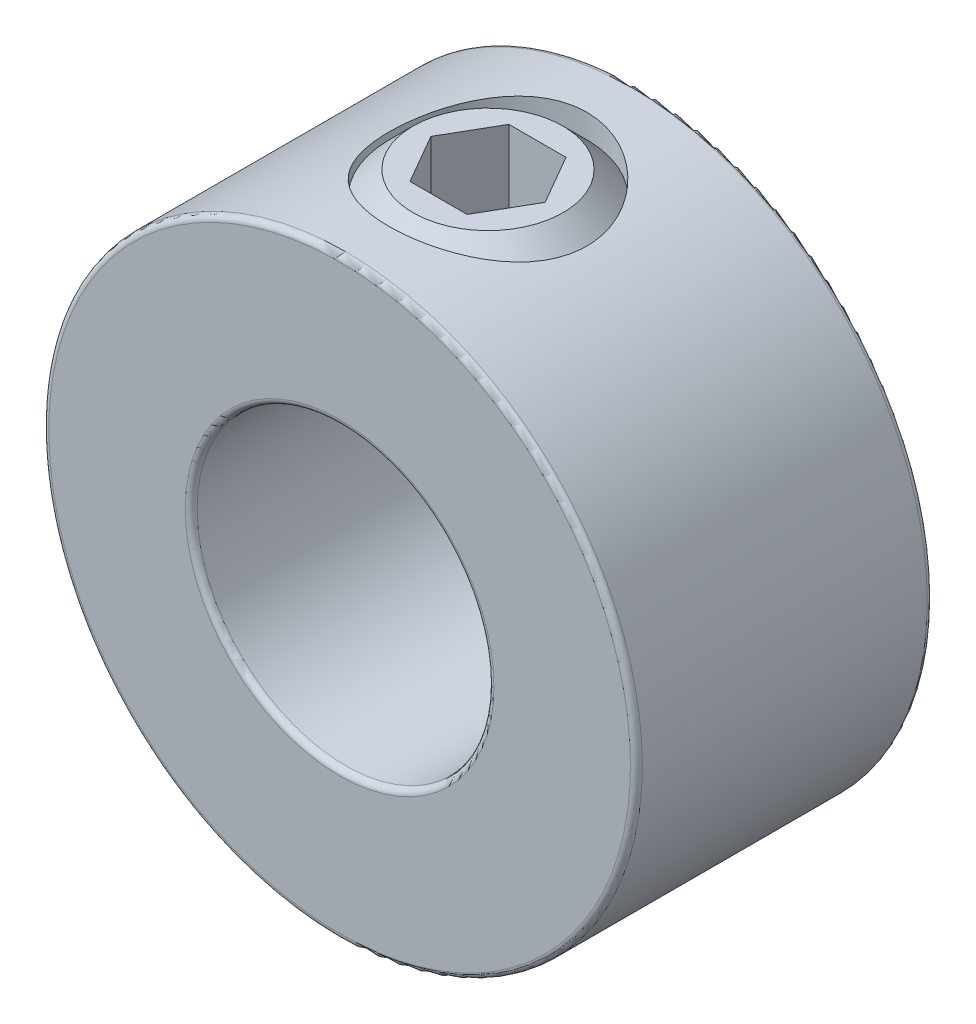
ISO-10303-21;
HEADER;
FILE_DESCRIPTION(('STEP AP214'),'2;1');
FILE_NAME('part.step','',(''),(''),'','','');
FILE_SCHEMA(('AUTOMOTIVE_DESIGN { 1 0 10303 214 1 1 1 1 }'));
ENDSEC;
DATA;
#1=APPLICATION_CONTEXT('core data for automotive mechanical design processes');
#2=APPLICATION_PROTOCOL_DEFINITION('international standard','automotive_design',2000,#1);
#3=PRODUCT_CONTEXT('',#1,'mechanical');
#4=PRODUCT('Part','Part','',(#3));
#5=PRODUCT_RELATED_PRODUCT_CATEGORY('part','',(#4));
#6=PRODUCT_DEFINITION_FORMATION('','',#4);
#7=PRODUCT_DEFINITION_CONTEXT('part definition',#1,'design');
#8=PRODUCT_DEFINITION('design','',#6,#7);
#9=PRODUCT_DEFINITION_SHAPE('','',#8);
#10=(LENGTH_UNIT() NAMED_UNIT(*) SI_UNIT(.MILLI.,.METRE.));
#11=(NAMED_UNIT(*) PLANE_ANGLE_UNIT() SI_UNIT($,.RADIAN.));
#12=(NAMED_UNIT(*) SI_UNIT($,.STERADIAN.) SOLID_ANGLE_UNIT());
#13=UNCERTAINTY_MEASURE_WITH_UNIT(LENGTH_MEASURE(1.E-05),#10,'distance_accuracy_value','');
#14=(GEOMETRIC_REPRESENTATION_CONTEXT(3) GLOBAL_UNCERTAINTY_ASSIGNED_CONTEXT((#13)) GLOBAL_UNIT_ASSIGNED_CONTEXT((#10,
#11,#12)) REPRESENTATION_CONTEXT('',''));
#15=CARTESIAN_POINT('',(0.,0.,0.));
#16=DIRECTION('',(0.,0.,1.));
#17=DIRECTION('',(1.,0.,0.));
#18=AXIS2_PLACEMENT_3D('',#15,#16,#17);
#19=CARTESIAN_POINT('',(0.,9.525,0.));
#20=DIRECTION('',(0.,1.,0.));
#21=DIRECTION('',(-1.,0.,0.));
#22=AXIS2_PLACEMENT_3D('',#19,#20,#21);
#23=PLANE('',#22);
#24=CARTESIAN_POINT('',(0.,9.525,0.));
#25=DIRECTION('',(0.,1.,0.));
#26=DIRECTION('',(-1.,0.,0.));
#27=AXIS2_PLACEMENT_3D('',#24,#25,#26);
#28=CIRCLE('',#27,2.40819263124403);
#29=CARTESIAN_POINT('',(-2.40819263124403,9.525,0.));
#30=VERTEX_POINT('',#29);
#31=EDGE_CURVE('E12',#30,#30,#28,.T.);
#32=ORIENTED_EDGE('',*,*,#31,.T.);
#33=EDGE_LOOP('',(#32));
#34=FACE_BOUND('',#33,.T.);
#35=DIRECTION('',(1.,0.,0.));
#36=VECTOR('',#35,1.);
#37=CARTESIAN_POINT('',(-0.91654355233853,9.52499999999999,-1.5875));
#38=LINE('',#37,#36);
#39=CARTESIAN_POINT('',(-0.91654355233853,9.52499999999999,-1.5875));
#40=VERTEX_POINT('',#39);
#41=CARTESIAN_POINT('',(0.916543552338532,9.525,-1.5875));
#42=VERTEX_POINT('',#41);
#43=EDGE_CURVE('E112',#40,#42,#38,.T.);
#44=ORIENTED_EDGE('',*,*,#43,.T.);
#45=DIRECTION('',(0.5,0.,0.866025403784439));
#46=VECTOR('',#45,1.);
#47=CARTESIAN_POINT('',(0.916543552338532,9.52499999999999,-1.5875));
#48=LINE('',#47,#46);
#49=CARTESIAN_POINT('',(1.83308710467706,9.52499999999999,0.));
#50=VERTEX_POINT('',#49);
#51=EDGE_CURVE('E58',#42,#50,#48,.T.);
#52=ORIENTED_EDGE('',*,*,#51,.T.);
#53=DIRECTION('',(-0.5,0.,0.866025403784439));
#54=VECTOR('',#53,1.);
#55=CARTESIAN_POINT('',(1.83308710467706,9.52499999999999,0.));
#56=LINE('',#55,#54);
#57=CARTESIAN_POINT('',(0.916543552338532,9.52499999999999,1.5875));
#58=VERTEX_POINT('',#57);
#59=EDGE_CURVE('E116',#50,#58,#56,.T.);
#60=ORIENTED_EDGE('',*,*,#59,.T.);
#61=DIRECTION('',(-1.,0.,0.));
#62=VECTOR('',#61,1.);
#63=CARTESIAN_POINT('',(0.916543552338532,9.52499999999999,1.5875));
#64=LINE('',#63,#62);
#65=CARTESIAN_POINT('',(-0.91654355233853,9.52499999999999,1.5875));
#66=VERTEX_POINT('',#65);
#67=EDGE_CURVE('E179',#58,#66,#64,.T.);
#68=ORIENTED_EDGE('',*,*,#67,.T.);
#69=DIRECTION('',(-0.5,0.,-0.866025403784438));
#70=VECTOR('',#69,1.);
#71=CARTESIAN_POINT('',(-0.91654355233853,9.52499999999999,1.5875));
#72=LINE('',#71,#70);
#73=CARTESIAN_POINT('',(-1.83308710467706,9.52499999999999,0.));
#74=VERTEX_POINT('',#73);
#75=EDGE_CURVE('E164',#66,#74,#72,.T.);
#76=ORIENTED_EDGE('',*,*,#75,.T.);
#77=DIRECTION('',(0.5,0.,-0.866025403784439));
#78=VECTOR('',#77,1.);
#79=CARTESIAN_POINT('',(-1.83308710467706,9.52499999999999,0.));
#80=LINE('',#79,#78);
#81=EDGE_CURVE('E160',#74,#40,#80,.T.);
#82=ORIENTED_EDGE('',*,*,#81,.T.);
#83=EDGE_LOOP('',(#44,#52,#60,#68,#76,#82));
#84=FACE_BOUND('',#83,.T.);
#85=ADVANCED_FACE('F44',(#34,#84),#23,.T.);
#86=CARTESIAN_POINT('',(0.,9.525,0.));
#87=DIRECTION('',(0.,-1.,0.));
#88=DIRECTION('',(1.,0.,0.));
#89=AXIS2_PLACEMENT_3D('',#86,#87,#88);
#90=CONICAL_SURFACE('',#89,2.40819263124403,0.785398163397448);
#91=CARTESIAN_POINT('',(0.,8.75819263124404,0.));
#92=DIRECTION('',(0.,1.,0.));
#93=DIRECTION('',(-1.,0.,0.));
#94=AXIS2_PLACEMENT_3D('',#91,#92,#93);
#95=CIRCLE('',#94,3.175);
#96=CARTESIAN_POINT('',(-3.175,8.75819263124404,0.));
#97=VERTEX_POINT('',#96);
#98=EDGE_CURVE('E51',#97,#97,#95,.T.);
#99=ORIENTED_EDGE('',*,*,#98,.T.);
#100=EDGE_LOOP('',(#99));
#101=FACE_BOUND('',#100,.T.);
#102=ORIENTED_EDGE('',*,*,#31,.F.);
#103=EDGE_LOOP('',(#102));
#104=FACE_BOUND('',#103,.T.);
#105=ADVANCED_FACE('F134',(#101,#104),#90,.T.);
#106=CARTESIAN_POINT('',(0.,4.7625,0.));
#107=DIRECTION('',(0.,1.,0.));
#108=DIRECTION('',(-1.,0.,0.));
#109=AXIS2_PLACEMENT_3D('',#106,#107,#108);
#110=CYLINDRICAL_SURFACE('',#109,3.175);
#111=CARTESIAN_POINT('',(0.,5.52930736875596,0.));
#112=DIRECTION('',(0.,1.,0.));
#113=DIRECTION('',(-1.,0.,0.));
#114=AXIS2_PLACEMENT_3D('',#111,#112,#113);
#115=CIRCLE('',#114,3.175);
#116=CARTESIAN_POINT('',(-3.175,5.52930736875596,0.));
#117=VERTEX_POINT('',#116);
#118=EDGE_CURVE('E129',#117,#117,#115,.T.);
#119=ORIENTED_EDGE('',*,*,#118,.T.);
#120=EDGE_LOOP('',(#119));
#121=FACE_BOUND('',#120,.T.);
#122=ORIENTED_EDGE('',*,*,#98,.F.);
#123=EDGE_LOOP('',(#122));
#124=FACE_BOUND('',#123,.T.);
#125=ADVANCED_FACE('F137',(#121,#124),#110,.T.);
#126=CARTESIAN_POINT('',(0.,5.52930736875596,0.));
#127=DIRECTION('',(0.,1.,0.));
#128=DIRECTION('',(-1.,0.,0.));
#129=AXIS2_PLACEMENT_3D('',#126,#127,#128);
#130=CONICAL_SURFACE('',#129,3.175,0.785398163397449);
#131=CARTESIAN_POINT('',(0.,4.7625,0.));
#132=DIRECTION('',(0.,1.,0.));
#133=DIRECTION('',(-1.,0.,0.));
#134=AXIS2_PLACEMENT_3D('',#131,#132,#133);
#135=CIRCLE('',#134,2.40819263124403);
#136=CARTESIAN_POINT('',(-2.40819263124403,4.7625,0.));
#137=VERTEX_POINT('',#136);
#138=EDGE_CURVE('E121',#137,#137,#135,.T.);
#139=ORIENTED_EDGE('',*,*,#138,.T.);
#140=EDGE_LOOP('',(#139));
#141=FACE_BOUND('',#140,.T.);
#142=ORIENTED_EDGE('',*,*,#118,.F.);
#143=EDGE_LOOP('',(#142));
#144=FACE_BOUND('',#143,.T.);
#145=ADVANCED_FACE('F139',(#141,#144),#130,.T.);
#146=CARTESIAN_POINT('',(-2.40819263124403,4.7625,0.));
#147=DIRECTION('',(0.,-1.,0.));
#148=DIRECTION('',(1.,0.,0.));
#149=AXIS2_PLACEMENT_3D('',#146,#147,#148);
#150=PLANE('',#149);
#151=CARTESIAN_POINT('',(0.,4.7625,0.));
#152=DIRECTION('',(0.,1.,0.));
#153=DIRECTION('',(-1.,0.,0.));
#154=AXIS2_PLACEMENT_3D('',#151,#152,#153);
#155=CIRCLE('',#154,0.920168842507157);
#156=CARTESIAN_POINT('',(-0.920168842507157,4.7625,0.));
#157=VERTEX_POINT('',#156);
#158=EDGE_CURVE('E117',#157,#157,#155,.T.);
#159=ORIENTED_EDGE('',*,*,#158,.T.);
#160=EDGE_LOOP('',(#159));
#161=FACE_BOUND('',#160,.T.);
#162=ORIENTED_EDGE('',*,*,#138,.F.);
#163=EDGE_LOOP('',(#162));
#164=FACE_BOUND('',#163,.T.);
#165=ADVANCED_FACE('F146',(#161,#164),#150,.T.);
#166=CARTESIAN_POINT('',(0.,4.7625,0.));
#167=DIRECTION('',(0.,-1.,0.));
#168=DIRECTION('',(1.,0.,0.));
#169=AXIS2_PLACEMENT_3D('',#166,#167,#168);
#170=CONICAL_SURFACE('',#169,0.920168842507157,0.785398163397448);
#171=CARTESIAN_POINT('',(0.,5.68266884250716,0.));
#172=VERTEX_POINT('',#171);
#173=VERTEX_LOOP('',#172);
#174=FACE_BOUND('',#173,.T.);
#175=ORIENTED_EDGE('',*,*,#158,.F.);
#176=EDGE_LOOP('',(#175));
#177=FACE_BOUND('',#176,.T.);
#178=ADVANCED_FACE('F213',(#174,#177),#170,.F.);
#179=CARTESIAN_POINT('',(0.916543552338532,6.34999999999999,-1.5875));
#180=DIRECTION('',(-0.866025403784438,0.,0.5));
#181=DIRECTION('',(0.5,0.,0.866025403784439));
#182=AXIS2_PLACEMENT_3D('',#179,#180,#181);
#183=PLANE('',#182);
#184=ORIENTED_EDGE('',*,*,#51,.F.);
#185=DIRECTION('',(0.,1.,0.));
#186=VECTOR('',#185,1.);
#187=CARTESIAN_POINT('',(0.916543552338532,6.34999999999999,-1.5875));
#188=LINE('',#187,#186);
#189=CARTESIAN_POINT('',(0.916543552338532,6.34999999999999,-1.5875));
#190=VERTEX_POINT('',#189);
#191=EDGE_CURVE('E111',#190,#42,#188,.T.);
#192=ORIENTED_EDGE('',*,*,#191,.F.);
#193=DIRECTION('',(0.5,0.,0.866025403784439));
#194=VECTOR('',#193,1.);
#195=CARTESIAN_POINT('',(0.916543552338532,6.34999999999999,-1.5875));
#196=LINE('',#195,#194);
#197=CARTESIAN_POINT('',(1.83308710467706,6.34999999999999,0.));
#198=VERTEX_POINT('',#197);
#199=EDGE_CURVE('E102',#190,#198,#196,.T.);
#200=ORIENTED_EDGE('',*,*,#199,.T.);
#201=DIRECTION('',(0.,1.,0.));
#202=VECTOR('',#201,1.);
#203=CARTESIAN_POINT('',(1.83308710467706,6.34999999999999,0.));
#204=LINE('',#203,#202);
#205=EDGE_CURVE('E110',#198,#50,#204,.T.);
#206=ORIENTED_EDGE('',*,*,#205,.T.);
#207=EDGE_LOOP('',(#184,#192,#200,#206));
#208=FACE_BOUND('',#207,.T.);
#209=ADVANCED_FACE('F109',(#208),#183,.T.);
#210=CARTESIAN_POINT('',(1.83308710467706,6.34999999999999,0.));
#211=DIRECTION('',(-0.866025403784439,0.,-0.5));
#212=DIRECTION('',(-0.5,0.,0.866025403784439));
#213=AXIS2_PLACEMENT_3D('',#210,#211,#212);
#214=PLANE('',#213);
#215=ORIENTED_EDGE('',*,*,#59,.F.);
#216=ORIENTED_EDGE('',*,*,#205,.F.);
#217=DIRECTION('',(-0.5,0.,0.866025403784439));
#218=VECTOR('',#217,1.);
#219=CARTESIAN_POINT('',(1.83308710467706,6.34999999999999,0.));
#220=LINE('',#219,#218);
#221=CARTESIAN_POINT('',(0.916543552338532,6.34999999999999,1.5875));
#222=VERTEX_POINT('',#221);
#223=EDGE_CURVE('E98',#198,#222,#220,.T.);
#224=ORIENTED_EDGE('',*,*,#223,.T.);
#225=DIRECTION('',(0.,1.,0.));
#226=VECTOR('',#225,1.);
#227=CARTESIAN_POINT('',(0.916543552338532,6.34999999999999,1.5875));
#228=LINE('',#227,#226);
#229=EDGE_CURVE('E118',#222,#58,#228,.T.);
#230=ORIENTED_EDGE('',*,*,#229,.T.);
#231=EDGE_LOOP('',(#215,#216,#224,#230));
#232=FACE_BOUND('',#231,.T.);
#233=ADVANCED_FACE('F114',(#232),#214,.T.);
#234=CARTESIAN_POINT('',(0.916543552338532,6.34999999999999,1.5875));
#235=DIRECTION('',(0.,0.,-1.));
#236=DIRECTION('',(-1.,0.,0.));
#237=AXIS2_PLACEMENT_3D('',#234,#235,#236);
#238=PLANE('',#237);
#239=ORIENTED_EDGE('',*,*,#67,.F.);
#240=ORIENTED_EDGE('',*,*,#229,.F.);
#241=DIRECTION('',(-1.,0.,0.));
#242=VECTOR('',#241,1.);
#243=CARTESIAN_POINT('',(0.916543552338532,6.34999999999999,1.5875));
#244=LINE('',#243,#242);
#245=CARTESIAN_POINT('',(-0.91654355233853,6.34999999999999,1.5875));
#246=VERTEX_POINT('',#245);
#247=EDGE_CURVE('E104',#222,#246,#244,.T.);
#248=ORIENTED_EDGE('',*,*,#247,.T.);
#249=DIRECTION('',(0.,1.,0.));
#250=VECTOR('',#249,1.);
#251=CARTESIAN_POINT('',(-0.91654355233853,6.34999999999999,1.5875));
#252=LINE('',#251,#250);
#253=EDGE_CURVE('E123',#246,#66,#252,.T.);
#254=ORIENTED_EDGE('',*,*,#253,.T.);
#255=EDGE_LOOP('',(#239,#240,#248,#254));
#256=FACE_BOUND('',#255,.T.);
#257=ADVANCED_FACE('F177',(#256),#238,.T.);
#258=CARTESIAN_POINT('',(-0.91654355233853,6.34999999999999,1.5875));
#259=DIRECTION('',(0.866025403784438,0.,-0.5));
#260=DIRECTION('',(-0.5,0.,-0.866025403784439));
#261=AXIS2_PLACEMENT_3D('',#258,#259,#260);
#262=PLANE('',#261);
#263=ORIENTED_EDGE('',*,*,#75,.F.);
#264=ORIENTED_EDGE('',*,*,#253,.F.);
#265=DIRECTION('',(-0.5,0.,-0.866025403784438));
#266=VECTOR('',#265,1.);
#267=CARTESIAN_POINT('',(-0.91654355233853,6.34999999999999,1.5875));
#268=LINE('',#267,#266);
#269=CARTESIAN_POINT('',(-1.83308710467706,6.34999999999999,0.));
#270=VERTEX_POINT('',#269);
#271=EDGE_CURVE('E190',#246,#270,#268,.T.);
#272=ORIENTED_EDGE('',*,*,#271,.T.);
#273=DIRECTION('',(0.,1.,0.));
#274=VECTOR('',#273,1.);
#275=CARTESIAN_POINT('',(-1.83308710467706,6.34999999999999,0.));
#276=LINE('',#275,#274);
#277=EDGE_CURVE('E172',#270,#74,#276,.T.);
#278=ORIENTED_EDGE('',*,*,#277,.T.);
#279=EDGE_LOOP('',(#263,#264,#272,#278));
#280=FACE_BOUND('',#279,.T.);
#281=ADVANCED_FACE('F181',(#280),#262,.T.);
#282=CARTESIAN_POINT('',(-1.83308710467706,6.34999999999999,0.));
#283=DIRECTION('',(0.866025403784439,0.,0.5));
#284=DIRECTION('',(0.5,0.,-0.866025403784439));
#285=AXIS2_PLACEMENT_3D('',#282,#283,#284);
#286=PLANE('',#285);
#287=ORIENTED_EDGE('',*,*,#81,.F.);
#288=ORIENTED_EDGE('',*,*,#277,.F.);
#289=DIRECTION('',(0.5,0.,-0.866025403784439));
#290=VECTOR('',#289,1.);
#291=CARTESIAN_POINT('',(-1.83308710467706,6.34999999999999,0.));
#292=LINE('',#291,#290);
#293=CARTESIAN_POINT('',(-0.91654355233853,6.34999999999999,-1.5875));
#294=VERTEX_POINT('',#293);
#295=EDGE_CURVE('E188',#270,#294,#292,.T.);
#296=ORIENTED_EDGE('',*,*,#295,.T.);
#297=DIRECTION('',(0.,1.,0.));
#298=VECTOR('',#297,1.);
#299=CARTESIAN_POINT('',(-0.91654355233853,6.34999999999999,-1.5875));
#300=LINE('',#299,#298);
#301=EDGE_CURVE('E169',#294,#40,#300,.T.);
#302=ORIENTED_EDGE('',*,*,#301,.T.);
#303=EDGE_LOOP('',(#287,#288,#296,#302));
#304=FACE_BOUND('',#303,.T.);
#305=ADVANCED_FACE('F194',(#304),#286,.T.);
#306=CARTESIAN_POINT('',(-0.91654355233853,6.34999999999999,-1.5875));
#307=DIRECTION('',(0.,0.,1.));
#308=DIRECTION('',(1.,0.,0.));
#309=AXIS2_PLACEMENT_3D('',#306,#307,#308);
#310=PLANE('',#309);
#311=ORIENTED_EDGE('',*,*,#43,.F.);
#312=ORIENTED_EDGE('',*,*,#301,.F.);
#313=DIRECTION('',(1.,0.,0.));
#314=VECTOR('',#313,1.);
#315=CARTESIAN_POINT('',(-0.91654355233853,6.34999999999999,-1.5875));
#316=LINE('',#315,#314);
#317=EDGE_CURVE('E170',#294,#190,#316,.T.);
#318=ORIENTED_EDGE('',*,*,#317,.T.);
#319=ORIENTED_EDGE('',*,*,#191,.T.);
#320=EDGE_LOOP('',(#311,#312,#318,#319));
#321=FACE_BOUND('',#320,.T.);
#322=ADVANCED_FACE('F195',(#321),#310,.T.);
#323=CARTESIAN_POINT('',(0.,6.34999999999999,-3.175));
#324=DIRECTION('',(0.,1.,0.));
#325=DIRECTION('',(0.,0.,1.));
#326=AXIS2_PLACEMENT_3D('',#323,#324,#325);
#327=PLANE('',#326);
#328=ORIENTED_EDGE('',*,*,#199,.F.);
#329=ORIENTED_EDGE('',*,*,#317,.F.);
#330=ORIENTED_EDGE('',*,*,#295,.F.);
#331=ORIENTED_EDGE('',*,*,#271,.F.);
#332=ORIENTED_EDGE('',*,*,#247,.F.);
#333=ORIENTED_EDGE('',*,*,#223,.F.);
#334=EDGE_LOOP('',(#328,#329,#330,#331,#332,#333));
#335=FACE_BOUND('',#334,.T.);
#336=ADVANCED_FACE('F100',(#335),#327,.T.);
#337=CLOSED_SHELL('',(#85,#105,#125,#145,#165,#178,#209,#233,#257,#281,#305,#322,#336));
#338=MANIFOLD_SOLID_BREP('B2',#337);
#339=CARTESIAN_POINT('',(0.,0.,4.7625));
#340=DIRECTION('',(0.,0.,1.));
#341=DIRECTION('',(1.,0.,0.));
#342=AXIS2_PLACEMENT_3D('',#339,#340,#341);
#343=PLANE('',#342);
#344=CARTESIAN_POINT('',(0.,0.,4.7625));
#345=DIRECTION('',(0.,0.,1.));
#346=DIRECTION('',(1.,0.,0.));
#347=AXIS2_PLACEMENT_3D('',#344,#345,#346);
#348=CIRCLE('',#347,4.953);
#349=CARTESIAN_POINT('',(4.953,0.,4.7625));
#350=VERTEX_POINT('',#349);
#351=EDGE_CURVE('E309',#350,#350,#348,.F.);
#352=ORIENTED_EDGE('',*,*,#351,.T.);
#353=EDGE_LOOP('',(#352));
#354=FACE_BOUND('',#353,.T.);
#355=CARTESIAN_POINT('',(0.,0.,4.7625));
#356=DIRECTION('',(0.,0.,1.));
#357=DIRECTION('',(1.,0.,0.));
#358=AXIS2_PLACEMENT_3D('',#355,#356,#357);
#359=CIRCLE('',#358,9.3345);
#360=CARTESIAN_POINT('',(9.3345,0.,4.7625));
#361=VERTEX_POINT('',#360);
#362=EDGE_CURVE('E313',#361,#361,#359,.T.);
#363=ORIENTED_EDGE('',*,*,#362,.T.);
#364=EDGE_LOOP('',(#363));
#365=FACE_BOUND('',#364,.T.);
#366=ADVANCED_FACE('F298',(#354,#365),#343,.T.);
#367=CARTESIAN_POINT('',(0.,0.,-4.7625));
#368=DIRECTION('',(0.,0.,1.));
#369=DIRECTION('',(1.,0.,0.));
#370=AXIS2_PLACEMENT_3D('',#367,#368,#369);
#371=PLANE('',#370);
#372=CARTESIAN_POINT('',(0.,0.,-4.7625));
#373=DIRECTION('',(0.,0.,1.));
#374=DIRECTION('',(1.,0.,0.));
#375=AXIS2_PLACEMENT_3D('',#372,#373,#374);
#376=CIRCLE('',#375,4.953);
#377=CARTESIAN_POINT('',(4.953,0.,-4.7625));
#378=VERTEX_POINT('',#377);
#379=EDGE_CURVE('E324',#378,#378,#376,.T.);
#380=ORIENTED_EDGE('',*,*,#379,.T.);
#381=EDGE_LOOP('',(#380));
#382=FACE_BOUND('',#381,.T.);
#383=CARTESIAN_POINT('',(0.,0.,-4.7625));
#384=DIRECTION('',(0.,0.,1.));
#385=DIRECTION('',(1.,0.,0.));
#386=AXIS2_PLACEMENT_3D('',#383,#384,#385);
#387=CIRCLE('',#386,9.3345);
#388=CARTESIAN_POINT('',(9.3345,0.,-4.7625));
#389=VERTEX_POINT('',#388);
#390=EDGE_CURVE('E327',#389,#389,#387,.F.);
#391=ORIENTED_EDGE('',*,*,#390,.T.);
#392=EDGE_LOOP('',(#391));
#393=FACE_BOUND('',#392,.T.);
#394=ADVANCED_FACE('F363',(#382,#393),#371,.F.);
#395=CARTESIAN_POINT('',(0.,0.,4.7625));
#396=DIRECTION('',(0.,0.,-1.));
#397=DIRECTION('',(-1.,0.,0.));
#398=AXIS2_PLACEMENT_3D('',#395,#396,#397);
#399=CYLINDRICAL_SURFACE('',#398,9.525);
#400=CARTESIAN_POINT('',(0.,0.,-4.572));
#401=DIRECTION('',(0.,0.,1.));
#402=DIRECTION('',(1.,0.,0.));
#403=AXIS2_PLACEMENT_3D('',#400,#401,#402);
#404=CIRCLE('',#403,9.525);
#405=CARTESIAN_POINT('',(9.525,0.,-4.572));
#406=VERTEX_POINT('',#405);
#407=EDGE_CURVE('E43',#406,#406,#404,.T.);
#408=ORIENTED_EDGE('',*,*,#407,.T.);
#409=EDGE_LOOP('',(#408));
#410=FACE_BOUND('',#409,.T.);
#411=CARTESIAN_POINT('',(0.,0.,4.572));
#412=DIRECTION('',(0.,0.,1.));
#413=DIRECTION('',(1.,0.,0.));
#414=AXIS2_PLACEMENT_3D('',#411,#412,#413);
#415=CIRCLE('',#414,9.525);
#416=CARTESIAN_POINT('',(9.525,0.,4.572));
#417=VERTEX_POINT('',#416);
#418=EDGE_CURVE('E305',#417,#417,#415,.F.);
#419=ORIENTED_EDGE('',*,*,#418,.T.);
#420=EDGE_LOOP('',(#419));
#421=FACE_BOUND('',#420,.T.);
#422=CARTESIAN_POINT('',(0.,9.525,-3.175));
#423=CARTESIAN_POINT('',(0.173238677165346,9.52500048580498,-3.17500080559796));
#424=CARTESIAN_POINT('',(0.346472492659896,9.52023018186455,-3.16077515504608));
#425=CARTESIAN_POINT('',(0.687837590771686,9.50167042395416,-3.10442257950533));
#426=CARTESIAN_POINT('',(0.855968341777246,9.48788003366834,-3.06229275796217));
#427=CARTESIAN_POINT('',(1.18215660666814,9.45277852602955,-2.95173640225564));
#428=CARTESIAN_POINT('',(1.34023044718816,9.43147998545459,-2.88335382669181));
#429=CARTESIAN_POINT('',(1.6426654243569,9.3835361515256,-2.72243177623824));
#430=CARTESIAN_POINT('',(1.78702384834389,9.35688980370195,-2.62988753611674));
#431=CARTESIAN_POINT('',(2.06292981819569,9.30002249856541,-2.41990306957346));
#432=CARTESIAN_POINT('',(2.19393674844713,9.26971591772517,-2.30177583122293));
#433=CARTESIAN_POINT('',(2.43469379932911,9.20941499436411,-2.04543928380665));
#434=CARTESIAN_POINT('',(2.54443923892904,9.17942072197493,-1.90722556410197));
#435=CARTESIAN_POINT('',(2.74264419157345,9.12219830615344,-1.60977225925124));
#436=CARTESIAN_POINT('',(2.83040092485178,9.0950744970031,-1.45004237635051));
#437=CARTESIAN_POINT('',(2.97757492456176,9.04796594704059,-1.11704090009411));
#438=CARTESIAN_POINT('',(3.03700083920298,9.02797902810367,-0.943773458008286));
#439=CARTESIAN_POINT('',(3.12379824029159,8.99830887880273,-0.594762521747942));
#440=CARTESIAN_POINT('',(3.15218269826287,8.98830104068516,-0.419299363047218));
#441=CARTESIAN_POINT('',(3.17925806658696,8.97876209798686,-0.065837580555076));
#442=CARTESIAN_POINT('',(3.17795815259498,8.97922775597168,0.112160242751682));
#443=CARTESIAN_POINT('',(3.14648819425835,8.99029872650972,0.45699880165977));
#444=CARTESIAN_POINT('',(3.11764017430521,9.00043970379417,0.623977679267887));
#445=CARTESIAN_POINT('',(3.0340495670469,9.02895888275449,0.950574107251702));
#446=CARTESIAN_POINT('',(2.97930387942919,9.04733807064542,1.11019077375635));
#447=CARTESIAN_POINT('',(2.84460650934117,9.09059367841715,1.42053547995295));
#448=CARTESIAN_POINT('',(2.76426310464556,9.11556996393148,1.57107898086575));
#449=CARTESIAN_POINT('',(2.58092291251247,9.16916373477931,1.85696513378813));
#450=CARTESIAN_POINT('',(2.47791958175572,9.19778227084722,1.99230337801349));
#451=CARTESIAN_POINT('',(2.2458341312661,9.25726270107577,2.25136582416045));
#452=CARTESIAN_POINT('',(2.11567125149229,9.28816371201626,2.3741148050663));
#453=CARTESIAN_POINT('',(1.83622813465495,9.34742029378842,2.59629677165629));
#454=CARTESIAN_POINT('',(1.68694606622308,9.37577562033364,2.69572752117228));
#455=CARTESIAN_POINT('',(1.3714336714219,9.42711817702495,2.86923575324634));
#456=CARTESIAN_POINT('',(1.20504990262187,9.45004936275525,2.94305193500683));
#457=CARTESIAN_POINT('',(0.861279339682312,9.4875530068358,3.06134507730938));
#458=CARTESIAN_POINT('',(0.683896391141978,9.50212836854242,3.10583222946942));
#459=CARTESIAN_POINT('',(0.33141865875554,9.52079715951823,3.16247673962099));
#460=CARTESIAN_POINT('',(0.156557979570887,9.52531755822087,3.17595189412349));
#461=CARTESIAN_POINT('',(-0.192960847123753,9.52464766056077,3.17394376132486));
#462=CARTESIAN_POINT('',(-0.36761902383989,9.51945900331475,3.15846536206389));
#463=CARTESIAN_POINT('',(-0.706500575516011,9.50023578476806,3.10003219293833));
#464=CARTESIAN_POINT('',(-0.870879661700627,9.48646180908036,3.05788629579286));
#465=CARTESIAN_POINT('',(-1.19016766849014,9.45171613685472,2.94832581381814));
#466=CARTESIAN_POINT('',(-1.34507537851482,9.43074352248193,2.88090800668978));
#467=CARTESIAN_POINT('',(-1.64556534104864,9.38304356837145,2.72075137890551));
#468=CARTESIAN_POINT('',(-1.79079512051444,9.35617936849621,2.62739316632593));
#469=CARTESIAN_POINT('',(-2.06395583568049,9.29974181184133,2.41873357370719));
#470=CARTESIAN_POINT('',(-2.19188146775096,9.27016762910402,2.30342549209915));
#471=CARTESIAN_POINT('',(-2.432851712285,9.20993992337912,2.04794246555408));
#472=CARTESIAN_POINT('',(-2.54495607735532,9.17929841452584,1.90687570450722));
#473=CARTESIAN_POINT('',(-2.74401763337735,9.121774152107,1.60727527220044));
#474=CARTESIAN_POINT('',(-2.83097461468097,9.09489142987857,1.44874145533681));
#475=CARTESIAN_POINT('',(-2.97687025407195,9.04819093937643,1.11863817645458));
#476=CARTESIAN_POINT('',(-3.03586556962394,9.02835890517708,0.947095898639171));
#477=CARTESIAN_POINT('',(-3.12386556696095,8.99829392572977,0.595697786109888));
#478=CARTESIAN_POINT('',(-3.15288375947876,8.98805665630055,0.415845734841193));
#479=CARTESIAN_POINT('',(-3.17905219686556,8.97883201925513,0.0628742200700937));
#480=CARTESIAN_POINT('',(-3.17776306695417,8.97929370817293,-0.110116430410661));
#481=CARTESIAN_POINT('',(-3.1471942816996,8.99005281690779,-0.453279112877545));
#482=CARTESIAN_POINT('',(-3.11791629228101,9.00034965132723,-0.623451312007403));
#483=CARTESIAN_POINT('',(-3.03330550668567,9.02920864668031,-0.952930730032847));
#484=CARTESIAN_POINT('',(-2.97847812359926,9.04761011221366,-1.11238291938927));
#485=CARTESIAN_POINT('',(-2.84473448628719,9.09054566248638,-1.419947017029));
#486=CARTESIAN_POINT('',(-2.76581288515833,9.11508110823773,-1.56805639902192));
#487=CARTESIAN_POINT('',(-2.58210269895239,9.16885482792697,-1.85573565200524));
#488=CARTESIAN_POINT('',(-2.47633567077754,9.19825159463785,-1.99465089352737));
#489=CARTESIAN_POINT('',(-2.24359115395568,9.25777156199328,-2.25326515749483));
#490=CARTESIAN_POINT('',(-2.11660766813345,9.28789496596782,-2.37295872780963));
#491=CARTESIAN_POINT('',(-1.83909194322319,9.34688346918603,-2.59443350901814));
#492=CARTESIAN_POINT('',(-1.68783480536164,9.3756537721899,-2.69533480410942));
#493=CARTESIAN_POINT('',(-1.36955960976604,9.42740021973043,-2.8701696116008));
#494=CARTESIAN_POINT('',(-1.20254559507021,9.45037784507677,-2.94411001830248));
#495=CARTESIAN_POINT('',(-0.865167329863099,9.4870751034262,-3.05981618315153));
#496=CARTESIAN_POINT('',(-0.695286130622597,9.50116249441509,-3.10287183038622));
#497=CARTESIAN_POINT('',(-0.350267320832534,9.52012342428904,-3.16045939114987));
#498=CARTESIAN_POINT('',(-0.175131176180769,9.52499950888798,-3.1749991856015));
#499=CARTESIAN_POINT('',(0.,9.525,-3.175));
#500=B_SPLINE_CURVE_WITH_KNOTS('',3,(#422,#423,#424,#425,#426,#427,#428,#429,#430,#431,#432,
#433,#434,#435,#436,#437,#438,#439,#440,#441,#442,#443,#444,#445,#446,#447,#448,#449,#450,#451,
#452,#453,#454,#455,#456,#457,#458,#459,#460,#461,#462,#463,#464,#465,#466,#467,#468,#469,#470,
#471,#472,#473,#474,#475,#476,#477,#478,#479,#480,#481,#482,#483,#484,#485,#486,#487,#488,#489,
#490,#491,#492,#493,#494,#495,#496,#497,#498,#499),.UNSPECIFIED.,.T.,.F.,(4,2,2,2,2,2,2,2,2,2,2,
2,2,2,2,2,2,2,2,2,2,2,2,2,2,2,2,2,2,2,2,2,2,2,2,2,2,2,4),(0.,0.519071561632585,1.03819701322438,
1.55645698636312,2.07481924951214,2.6093637259775,3.14402575687908,3.69406121814519,
4.24392866899746,4.77526114230342,5.30642937910266,5.81332424300314,6.32027980466155,
6.83539943417539,7.35066800622307,7.8928374595109,8.43505888444013,8.98265937939885,
9.53006948685136,10.0537512658116,10.5773446429626,11.0857715158083,11.5942632377703,
12.1161301950386,12.638156741095,13.1839024764639,13.7296527614611,14.274292439,
14.8186865394104,15.3351123975402,15.8515075194062,16.3580948898032,16.8647947620873,
17.3936046174648,17.92256420318,18.4721392315144,19.0215736265905,19.5464607283686,
20.0712027467109),.UNSPECIFIED.);
#501=CARTESIAN_POINT('',(0.,9.525,-3.175));
#502=VERTEX_POINT('',#501);
#503=EDGE_CURVE('E330',#502,#502,#500,.T.);
#504=ORIENTED_EDGE('',*,*,#503,.T.);
#505=EDGE_LOOP('',(#504));
#506=FACE_BOUND('',#505,.T.);
#507=ADVANCED_FACE('F359',(#410,#421,#506),#399,.T.);
#508=CARTESIAN_POINT('',(0.,0.,4.7625));
#509=DIRECTION('',(0.,0.,-1.));
#510=DIRECTION('',(-1.,0.,0.));
#511=AXIS2_PLACEMENT_3D('',#508,#509,#510);
#512=CYLINDRICAL_SURFACE('',#511,4.7625);
#513=CARTESIAN_POINT('',(0.,0.,-4.572));
#514=DIRECTION('',(0.,0.,1.));
#515=DIRECTION('',(1.,0.,0.));
#516=AXIS2_PLACEMENT_3D('',#513,#514,#515);
#517=CIRCLE('',#516,4.7625);
#518=CARTESIAN_POINT('',(4.7625,0.,-4.572));
#519=VERTEX_POINT('',#518);
#520=EDGE_CURVE('E318',#519,#519,#517,.F.);
#521=ORIENTED_EDGE('',*,*,#520,.T.);
#522=EDGE_LOOP('',(#521));
#523=FACE_BOUND('',#522,.T.);
#524=CARTESIAN_POINT('',(0.,0.,4.572));
#525=DIRECTION('',(0.,0.,1.));
#526=DIRECTION('',(1.,0.,0.));
#527=AXIS2_PLACEMENT_3D('',#524,#525,#526);
#528=CIRCLE('',#527,4.7625);
#529=CARTESIAN_POINT('',(4.7625,0.,4.572));
#530=VERTEX_POINT('',#529);
#531=EDGE_CURVE('E321',#530,#530,#528,.T.);
#532=ORIENTED_EDGE('',*,*,#531,.T.);
#533=EDGE_LOOP('',(#532));
#534=FACE_BOUND('',#533,.T.);
#535=CARTESIAN_POINT('',(0.,4.7625,-3.175));
#536=CARTESIAN_POINT('',(0.159513506146526,4.76249829558772,-3.17499785387674));
#537=CARTESIAN_POINT('',(0.319036822940597,4.75441585981929,-3.16291201378244));
#538=CARTESIAN_POINT('',(0.632990333269339,4.72288699141972,-3.1153157875296));
#539=CARTESIAN_POINT('',(0.787418072256468,4.6994332647002,-3.07979428046729));
#540=CARTESIAN_POINT('',(1.0861866118583,4.63947623936465,-2.98750378332687));
#541=CARTESIAN_POINT('',(1.23057094564588,4.60303407934685,-2.93083428235374));
#542=CARTESIAN_POINT('',(1.50719688917279,4.52002748417047,-2.79866196869855));
#543=CARTESIAN_POINT('',(1.63943673208792,4.47346157948094,-2.72315642160038));
#544=CARTESIAN_POINT('',(1.90068942785739,4.36923384005694,-2.54848209446027));
#545=CARTESIAN_POINT('',(2.0284762255929,4.31096574538352,-2.44784901636421));
#546=CARTESIAN_POINT('',(2.26651828028912,4.19071922389352,-2.22927855246795));
#547=CARTESIAN_POINT('',(2.37674794067855,4.12873555797057,-2.11131637522972));
#548=CARTESIAN_POINT('',(2.59432897361932,3.99618620055343,-1.83982936485523));
#549=CARTESIAN_POINT('',(2.69848308269039,3.92580920318787,-1.68363002512644));
#550=CARTESIAN_POINT('',(2.87893691841686,3.79546083955007,-1.35197313839848));
#551=CARTESIAN_POINT('',(2.95528481583058,3.73547157335729,-1.17654958761288));
#552=CARTESIAN_POINT('',(3.0587003056751,3.65087323287846,-0.862470821626492));
#553=CARTESIAN_POINT('',(3.09363184983488,3.62104984276855,-0.727823581043082));
#554=CARTESIAN_POINT('',(3.14564105737718,3.57597026836952,-0.452843098742185));
#555=CARTESIAN_POINT('',(3.16274949511548,3.56068897885195,-0.312520093909076));
#556=CARTESIAN_POINT('',(3.17803790572636,3.54705611398895,-0.0294087885536061));
#557=CARTESIAN_POINT('',(3.17614050629003,3.54877374048434,0.113387224758058));
#558=CARTESIAN_POINT('',(3.1533716036927,3.56901393593137,0.396295520403469));
#559=CARTESIAN_POINT('',(3.13248402562585,3.58755074204361,0.536405426371809));
#560=CARTESIAN_POINT('',(3.07443178311274,3.63739407712628,0.804016443958601));
#561=CARTESIAN_POINT('',(3.03802591942409,3.66810112544892,0.931801121179955));
#562=CARTESIAN_POINT('',(2.95068813219861,3.73871526235139,1.17955010979676));
#563=CARTESIAN_POINT('',(2.89975142875274,3.77862537744388,1.29951183185715));
#564=CARTESIAN_POINT('',(2.77294687249444,3.87293161809884,1.55420281498847));
#565=CARTESIAN_POINT('',(2.69411533030023,3.92862304429405,1.68697259197917));
#566=CARTESIAN_POINT('',(2.51886974692605,4.04322816135652,1.93894614005392));
#567=CARTESIAN_POINT('',(2.42243402035992,4.10214576296336,2.05813288170832));
#568=CARTESIAN_POINT('',(2.19045099950254,4.23137558230652,2.30591129113202));
#569=CARTESIAN_POINT('',(2.05095377025594,4.30140657245416,2.43099280228032));
#570=CARTESIAN_POINT('',(1.74943769853673,4.43258734804498,2.65619943508341));
#571=CARTESIAN_POINT('',(1.58744015020742,4.493745420159,2.75634790583761));
#572=CARTESIAN_POINT('',(1.2777118005163,4.59018328993748,2.91064587831312));
#573=CARTESIAN_POINT('',(1.13340775885306,4.62818577100373,2.96996383930038));
#574=CARTESIAN_POINT('',(0.835082219747426,4.69118503960837,3.06721656943046));
#575=CARTESIAN_POINT('',(0.681069057915083,4.71619281752454,3.10516941057244));
#576=CARTESIAN_POINT('',(0.366689406911032,4.75100462923954,3.15779334981527));
#577=CARTESIAN_POINT('',(0.206298501445472,4.76074299407139,3.17236389423949));
#578=CARTESIAN_POINT('',(-0.115000912030585,4.76381945007165,3.17697975309251));
#579=CARTESIAN_POINT('',(-0.27590938307122,4.75715868774695,3.16702678202589));
#580=CARTESIAN_POINT('',(-0.581748451061773,4.72915598211033,3.12479681179543));
#581=CARTESIAN_POINT('',(-0.727007443428387,4.70887816144478,3.09413703981371));
#582=CARTESIAN_POINT('',(-1.00983477297833,4.65643038239684,3.01371684845446));
#583=CARTESIAN_POINT('',(-1.14740187964354,4.62425852748368,2.963953382901));
#584=CARTESIAN_POINT('',(-1.42028029136544,4.54812959640013,2.84376447844169));
#585=CARTESIAN_POINT('',(-1.55495019310495,4.50357668840463,2.77227005539697));
#586=CARTESIAN_POINT('',(-1.81083430052963,4.40692945783369,2.61233715220837));
#587=CARTESIAN_POINT('',(-1.93204012275933,4.35483048266614,2.52388820764801));
#588=CARTESIAN_POINT('',(-2.17781894704302,4.23790342811906,2.31678500930826));
#589=CARTESIAN_POINT('',(-2.29989360271145,4.17236523918599,2.19556606216409));
#590=CARTESIAN_POINT('',(-2.52307674305786,4.04131737275621,1.93498560490976));
#591=CARTESIAN_POINT('',(-2.62417073664107,3.97580774594569,1.79561166279185));
#592=CARTESIAN_POINT('',(-2.79598082787364,3.85666740360083,1.51266141984501));
#593=CARTESIAN_POINT('',(-2.86854322403869,3.80250060257811,1.37043789728911));
#594=CARTESIAN_POINT('',(-2.99237739257787,3.70584371667973,1.07335216383611));
#595=CARTESIAN_POINT('',(-3.04368748566418,3.66333266217137,0.918513308918401));
#596=CARTESIAN_POINT('',(-3.11524401668582,3.60256467927562,0.627753877826356));
#597=CARTESIAN_POINT('',(-3.13941774208684,3.58132059145467,0.493439756093283));
#598=CARTESIAN_POINT('',(-3.17022488831674,3.55408653184003,0.221339911640261));
#599=CARTESIAN_POINT('',(-3.17687736084456,3.54807999179148,0.0835581242544777));
#600=CARTESIAN_POINT('',(-3.17220478264998,3.55225668535638,-0.191520836727938));
#601=CARTESIAN_POINT('',(-3.16086908702961,3.56244950530632,-0.328817675150234));
#602=CARTESIAN_POINT('',(-3.12097725174618,3.59744096141944,-0.599032910654162));
#603=CARTESIAN_POINT('',(-3.09239813794198,3.6222590824651,-0.731945216428473));
#604=CARTESIAN_POINT('',(-3.00978981561158,3.69136350740653,-1.02506622898968));
#605=CARTESIAN_POINT('',(-2.9510082914772,3.7390752101256,-1.18311132192876));
#606=CARTESIAN_POINT('',(-2.81121528101009,3.84527739400297,-1.48508652360585));
#607=CARTESIAN_POINT('',(-2.7301725841297,3.90378297026142,-1.6289964271167));
#608=CARTESIAN_POINT('',(-2.54632873237353,4.02617059026332,-1.90385549633636));
#609=CARTESIAN_POINT('',(-2.44315837250285,4.09013111420677,-2.03452106373605));
#610=CARTESIAN_POINT('',(-2.21726660759133,4.21685775015533,-2.27859138405742));
#611=CARTESIAN_POINT('',(-2.09453921249741,4.27962348959933,-2.39199082772431));
#612=CARTESIAN_POINT('',(-1.8873850660108,4.37333498138708,-2.55491858498312));
#613=CARTESIAN_POINT('',(-1.8090134436431,4.40641312548886,-2.61102761986732));
#614=CARTESIAN_POINT('',(-1.64665981934884,4.46961905722944,-2.71633779885705));
#615=CARTESIAN_POINT('',(-1.56268042207704,4.49974819878214,-2.76554211752335));
#616=CARTESIAN_POINT('',(-1.38960715113393,4.55616827072524,-2.85642356224378));
#617=CARTESIAN_POINT('',(-1.30051812806183,4.58246276002165,-2.89810767636216));
#618=CARTESIAN_POINT('',(-1.11782960098096,4.63042056995049,-2.97335672820606));
#619=CARTESIAN_POINT('',(-1.02423169482462,4.65208551661339,-3.00692451716838));
#620=CARTESIAN_POINT('',(-0.780235392827374,4.70058109652366,-3.08154139984118));
#621=CARTESIAN_POINT('',(-0.627104096318095,4.72362103868264,-3.11642765689178));
#622=CARTESIAN_POINT('',(-0.315982580686494,4.75457565287333,-3.16314936096945));
#623=CARTESIAN_POINT('',(-0.157996102785209,4.76250168819873,-3.17500212570784));
#624=CARTESIAN_POINT('',(0.,4.7625,-3.175));
#625=B_SPLINE_CURVE_WITH_KNOTS('',3,(#535,#536,#537,#538,#539,#540,#541,#542,#543,#544,#545,
#546,#547,#548,#549,#550,#551,#552,#553,#554,#555,#556,#557,#558,#559,#560,#561,#562,#563,#564,
#565,#566,#567,#568,#569,#570,#571,#572,#573,#574,#575,#576,#577,#578,#579,#580,#581,#582,#583,
#584,#585,#586,#587,#588,#589,#590,#591,#592,#593,#594,#595,#596,#597,#598,#599,#600,#601,#602,
#603,#604,#605,#606,#607,#608,#609,#610,#611,#612,#613,#614,#615,#616,#617,#618,#619,#620,#621,
#622,#623,#624),.UNSPECIFIED.,.T.,.F.,(4,2,2,2,2,2,2,2,2,2,2,2,2,2,2,2,2,2,2,2,2,2,2,2,2,2,2,2,
2,2,2,2,2,2,2,2,2,2,2,2,2,2,2,2,4),(0.,0.477921997077321,0.956070945278542,1.43199826818949,
1.90799472139476,2.42438283538384,2.94151703421856,3.54023109732372,4.13790297394634,
4.56300988710696,4.98738156455221,5.41348154879912,5.83994255655571,6.24758818745148,
6.6553680680092,7.14609274784494,7.63742604761198,8.23466340273952,8.8313393398877,
9.31106989228961,9.79039404549573,10.2717740223998,10.7531203456965,11.2006552211841,
11.6482614879236,12.1229810060221,12.5979944723587,13.1481222963466,13.6986288317687,
14.2025677230621,14.705593948025,15.1181442623597,15.5302458053914,15.9425913096208,
16.3554874162604,16.8784049132826,17.4020593249786,17.9352455177248,18.4685953331297,
18.7739424593009,19.0791487337135,19.3840699212457,19.6888838348845,20.1626158186784,
20.635991489477),.UNSPECIFIED.);
#626=CARTESIAN_POINT('',(0.,4.7625,-3.175));
#627=VERTEX_POINT('',#626);
#628=EDGE_CURVE('E331',#627,#627,#625,.T.);
#629=ORIENTED_EDGE('',*,*,#628,.F.);
#630=EDGE_LOOP('',(#629));
#631=FACE_BOUND('',#630,.T.);
#632=ADVANCED_FACE('F343',(#523,#534,#631),#512,.F.);
#633=CARTESIAN_POINT('',(0.,9.525,0.));
#634=DIRECTION('',(0.,-1.,0.));
#635=DIRECTION('',(0.,0.,-1.));
#636=AXIS2_PLACEMENT_3D('',#633,#634,#635);
#637=CYLINDRICAL_SURFACE('',#636,3.175);
#638=ORIENTED_EDGE('',*,*,#628,.T.);
#639=EDGE_LOOP('',(#638));
#640=FACE_BOUND('',#639,.T.);
#641=ORIENTED_EDGE('',*,*,#503,.F.);
#642=EDGE_LOOP('',(#641));
#643=FACE_BOUND('',#642,.T.);
#644=ADVANCED_FACE('F346',(#640,#643),#637,.F.);
#645=CARTESIAN_POINT('',(0.,0.,-4.572));
#646=DIRECTION('',(0.,0.,1.));
#647=DIRECTION('',(1.,0.,0.));
#648=AXIS2_PLACEMENT_3D('',#645,#646,#647);
#649=TOROIDAL_SURFACE('',#648,4.953,0.1905);
#650=ORIENTED_EDGE('',*,*,#520,.F.);
#651=EDGE_LOOP('',(#650));
#652=FACE_BOUND('',#651,.T.);
#653=ORIENTED_EDGE('',*,*,#379,.F.);
#654=EDGE_LOOP('',(#653));
#655=FACE_BOUND('',#654,.T.);
#656=ADVANCED_FACE('F349',(#652,#655),#649,.T.);
#657=CARTESIAN_POINT('',(0.,0.,4.572));
#658=DIRECTION('',(0.,0.,1.));
#659=DIRECTION('',(1.,0.,0.));
#660=AXIS2_PLACEMENT_3D('',#657,#658,#659);
#661=TOROIDAL_SURFACE('',#660,4.953,0.1905);
#662=ORIENTED_EDGE('',*,*,#351,.F.);
#663=EDGE_LOOP('',(#662));
#664=FACE_BOUND('',#663,.T.);
#665=ORIENTED_EDGE('',*,*,#531,.F.);
#666=EDGE_LOOP('',(#665));
#667=FACE_BOUND('',#666,.T.);
#668=ADVANCED_FACE('F356',(#664,#667),#661,.T.);
#669=CARTESIAN_POINT('',(0.,0.,-4.572));
#670=DIRECTION('',(0.,0.,1.));
#671=DIRECTION('',(1.,0.,0.));
#672=AXIS2_PLACEMENT_3D('',#669,#670,#671);
#673=TOROIDAL_SURFACE('',#672,9.3345,0.1905);
#674=ORIENTED_EDGE('',*,*,#390,.F.);
#675=EDGE_LOOP('',(#674));
#676=FACE_BOUND('',#675,.T.);
#677=ORIENTED_EDGE('',*,*,#407,.F.);
#678=EDGE_LOOP('',(#677));
#679=FACE_BOUND('',#678,.T.);
#680=ADVANCED_FACE('F375',(#676,#679),#673,.T.);
#681=CARTESIAN_POINT('',(0.,0.,4.572));
#682=DIRECTION('',(0.,0.,1.));
#683=DIRECTION('',(1.,0.,0.));
#684=AXIS2_PLACEMENT_3D('',#681,#682,#683);
#685=TOROIDAL_SURFACE('',#684,9.3345,0.1905);
#686=ORIENTED_EDGE('',*,*,#418,.F.);
#687=EDGE_LOOP('',(#686));
#688=FACE_BOUND('',#687,.T.);
#689=ORIENTED_EDGE('',*,*,#362,.F.);
#690=EDGE_LOOP('',(#689));
#691=FACE_BOUND('',#690,.T.);
#692=ADVANCED_FACE('F300',(#688,#691),#685,.T.);
#693=CLOSED_SHELL('',(#366,#394,#507,#632,#644,#656,#668,#680,#692));
#694=MANIFOLD_SOLID_BREP('B6',#693);
#695=ADVANCED_BREP_SHAPE_REPRESENTATION('',(#18,#338,#694),#14);
#696=SHAPE_DEFINITION_REPRESENTATION(#9,#695);
ENDSEC;
END-ISO-10303-21;
